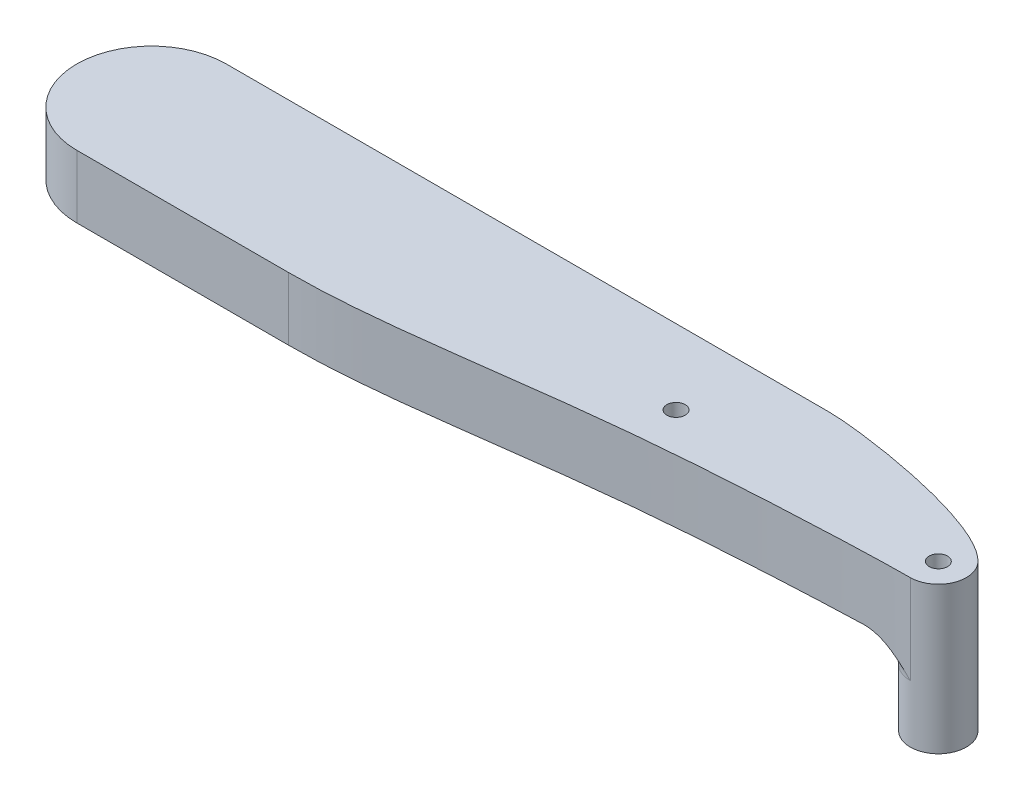
ISO-10303-21;
HEADER;
FILE_DESCRIPTION(('STEP AP214'),'2;1');
FILE_NAME('part.step','',(''),(''),'','','');
FILE_SCHEMA(('AUTOMOTIVE_DESIGN { 1 0 10303 214 1 1 1 1 }'));
ENDSEC;
DATA;
#1=APPLICATION_CONTEXT('core data for automotive mechanical design processes');
#2=APPLICATION_PROTOCOL_DEFINITION('international standard','automotive_design',2000,#1);
#3=PRODUCT_CONTEXT('',#1,'mechanical');
#4=PRODUCT('Part','Part','',(#3));
#5=PRODUCT_RELATED_PRODUCT_CATEGORY('part','',(#4));
#6=PRODUCT_DEFINITION_FORMATION('','',#4);
#7=PRODUCT_DEFINITION_CONTEXT('part definition',#1,'design');
#8=PRODUCT_DEFINITION('design','',#6,#7);
#9=PRODUCT_DEFINITION_SHAPE('','',#8);
#10=(LENGTH_UNIT() NAMED_UNIT(*) SI_UNIT(.MILLI.,.METRE.));
#11=(NAMED_UNIT(*) PLANE_ANGLE_UNIT() SI_UNIT($,.RADIAN.));
#12=(NAMED_UNIT(*) SI_UNIT($,.STERADIAN.) SOLID_ANGLE_UNIT());
#13=UNCERTAINTY_MEASURE_WITH_UNIT(LENGTH_MEASURE(1.E-05),#10,'distance_accuracy_value','');
#14=(GEOMETRIC_REPRESENTATION_CONTEXT(3) GLOBAL_UNCERTAINTY_ASSIGNED_CONTEXT((#13)) GLOBAL_UNIT_ASSIGNED_CONTEXT((#10,
#11,#12)) REPRESENTATION_CONTEXT('',''));
#15=CARTESIAN_POINT('',(0.,0.,0.));
#16=DIRECTION('',(0.,0.,1.));
#17=DIRECTION('',(1.,0.,0.));
#18=AXIS2_PLACEMENT_3D('',#15,#16,#17);
#19=CARTESIAN_POINT('',(-75.,12.,-14.25));
#20=DIRECTION('',(0.,0.,1.));
#21=DIRECTION('',(-1.,0.,0.));
#22=AXIS2_PLACEMENT_3D('',#19,#20,#21);
#23=PLANE('',#22);
#24=DIRECTION('',(0.,-1.,0.));
#25=VECTOR('',#24,1.);
#26=CARTESIAN_POINT('',(39.9337685956905,12.001,-14.25));
#27=LINE('',#26,#25);
#28=CARTESIAN_POINT('',(39.9337685956905,12.,-14.25));
#29=VERTEX_POINT('',#28);
#30=CARTESIAN_POINT('',(39.9337685956905,0.,-14.25));
#31=VERTEX_POINT('',#30);
#32=EDGE_CURVE('E124',#29,#31,#27,.T.);
#33=ORIENTED_EDGE('',*,*,#32,.T.);
#34=DIRECTION('',(1.,0.,0.));
#35=VECTOR('',#34,1.);
#36=CARTESIAN_POINT('',(-75.,0.,-14.25));
#37=LINE('',#36,#35);
#38=CARTESIAN_POINT('',(-75.,0.,-14.25));
#39=VERTEX_POINT('',#38);
#40=EDGE_CURVE('E142',#39,#31,#37,.T.);
#41=ORIENTED_EDGE('',*,*,#40,.F.);
#42=DIRECTION('',(0.,-1.,0.));
#43=VECTOR('',#42,1.);
#44=CARTESIAN_POINT('',(-75.,12.,-14.25));
#45=LINE('',#44,#43);
#46=CARTESIAN_POINT('',(-75.,12.,-14.25));
#47=VERTEX_POINT('',#46);
#48=EDGE_CURVE('E134',#47,#39,#45,.T.);
#49=ORIENTED_EDGE('',*,*,#48,.F.);
#50=DIRECTION('',(1.,0.,0.));
#51=VECTOR('',#50,1.);
#52=CARTESIAN_POINT('',(-75.,12.,-14.25));
#53=LINE('',#52,#51);
#54=EDGE_CURVE('E132',#47,#29,#53,.T.);
#55=ORIENTED_EDGE('',*,*,#54,.T.);
#56=EDGE_LOOP('',(#33,#41,#49,#55));
#57=FACE_BOUND('',#56,.T.);
#58=ADVANCED_FACE('F41',(#57),#23,.F.);
#59=CARTESIAN_POINT('',(-75.,12.,14.25));
#60=DIRECTION('',(0.,0.,1.));
#61=DIRECTION('',(-1.,0.,0.));
#62=AXIS2_PLACEMENT_3D('',#59,#60,#61);
#63=PLANE('',#62);
#64=DIRECTION('',(1.,0.,0.));
#65=VECTOR('',#64,1.);
#66=CARTESIAN_POINT('',(-75.,12.,14.25));
#67=LINE('',#66,#65);
#68=CARTESIAN_POINT('',(-75.,12.,14.25));
#69=VERTEX_POINT('',#68);
#70=CARTESIAN_POINT('',(-34.5980224377259,12.,14.25));
#71=VERTEX_POINT('',#70);
#72=EDGE_CURVE('E121',#69,#71,#67,.T.);
#73=ORIENTED_EDGE('',*,*,#72,.F.);
#74=DIRECTION('',(0.,-1.,0.));
#75=VECTOR('',#74,1.);
#76=CARTESIAN_POINT('',(-75.,12.,14.25));
#77=LINE('',#76,#75);
#78=CARTESIAN_POINT('',(-75.,0.,14.25));
#79=VERTEX_POINT('',#78);
#80=EDGE_CURVE('E131',#69,#79,#77,.T.);
#81=ORIENTED_EDGE('',*,*,#80,.T.);
#82=DIRECTION('',(1.,0.,0.));
#83=VECTOR('',#82,1.);
#84=CARTESIAN_POINT('',(-75.,0.,14.25));
#85=LINE('',#84,#83);
#86=CARTESIAN_POINT('',(-34.5980224377259,0.,14.25));
#87=VERTEX_POINT('',#86);
#88=EDGE_CURVE('E123',#79,#87,#85,.T.);
#89=ORIENTED_EDGE('',*,*,#88,.T.);
#90=DIRECTION('',(0.,-1.,0.));
#91=VECTOR('',#90,1.);
#92=CARTESIAN_POINT('',(-34.5980224377259,12.001,14.25));
#93=LINE('',#92,#91);
#94=EDGE_CURVE('E107',#71,#87,#93,.T.);
#95=ORIENTED_EDGE('',*,*,#94,.F.);
#96=EDGE_LOOP('',(#73,#81,#89,#95));
#97=FACE_BOUND('',#96,.T.);
#98=ADVANCED_FACE('F119',(#97),#63,.T.);
#99=CARTESIAN_POINT('',(-75.,0.,0.));
#100=DIRECTION('',(0.,1.,0.));
#101=DIRECTION('',(0.,0.,-1.));
#102=AXIS2_PLACEMENT_3D('',#99,#100,#101);
#103=PLANE('',#102);
#104=CARTESIAN_POINT('',(25.,0.,0.));
#105=DIRECTION('',(0.,-1.,0.));
#106=DIRECTION('',(0.,0.,-1.));
#107=AXIS2_PLACEMENT_3D('',#104,#105,#106);
#108=CIRCLE('',#107,1.75);
#109=CARTESIAN_POINT('',(25.,0.,-1.75));
#110=VERTEX_POINT('',#109);
#111=EDGE_CURVE('E143',#110,#110,#108,.T.);
#112=ORIENTED_EDGE('',*,*,#111,.F.);
#113=EDGE_LOOP('',(#112));
#114=FACE_BOUND('',#113,.T.);
#115=CARTESIAN_POINT('',(-34.5980224377259,0.,14.25));
#116=CARTESIAN_POINT('',(-16.7114247665398,0.,14.25));
#117=CARTESIAN_POINT('',(16.9697721095391,0.,7.11576395128839));
#118=CARTESIAN_POINT('',(68.5171140852767,0.,5.35000000000002));
#119=CARTESIAN_POINT('',(75.,0.,5.35000000000002));
#120=B_SPLINE_CURVE_WITH_KNOTS('',3,(#115,#116,#117,#118,#119),.UNSPECIFIED.,.F.,.F.,(4,1,4),
(0.,0.557363476483602,1.),.UNSPECIFIED.);
#121=CARTESIAN_POINT('',(66.2551672184016,0.,5.53628030557362));
#122=VERTEX_POINT('',#121);
#123=EDGE_CURVE('E179',#87,#122,#120,.T.);
#124=ORIENTED_EDGE('',*,*,#123,.F.);
#125=ORIENTED_EDGE('',*,*,#88,.F.);
#126=CARTESIAN_POINT('',(-75.,0.,0.));
#127=DIRECTION('',(0.,-1.,0.));
#128=DIRECTION('',(0.,0.,-1.));
#129=AXIS2_PLACEMENT_3D('',#126,#127,#128);
#130=CIRCLE('',#129,14.25);
#131=EDGE_CURVE('E140',#79,#39,#130,.T.);
#132=ORIENTED_EDGE('',*,*,#131,.T.);
#133=ORIENTED_EDGE('',*,*,#40,.T.);
#134=CARTESIAN_POINT('',(78.8479561308971,0.,-3.71695219429728));
#135=CARTESIAN_POINT('',(76.072393782244,0.,-6.5903392054546));
#136=CARTESIAN_POINT('',(61.3499696988219,0.,-12.0828531777784));
#137=CARTESIAN_POINT('',(43.7106323264205,0.,-14.25));
#138=CARTESIAN_POINT('',(39.9337685956905,0.,-14.25));
#139=B_SPLINE_CURVE_WITH_KNOTS('',3,(#134,#135,#136,#137,#138),.UNSPECIFIED.,.F.,.F.,(4,1,4),
(0.,0.424659955547958,1.),.UNSPECIFIED.);
#140=CARTESIAN_POINT('',(69.4691233137273,0.,-8.74825142992844));
#141=VERTEX_POINT('',#140);
#142=EDGE_CURVE('E172',#141,#31,#139,.T.);
#143=ORIENTED_EDGE('',*,*,#142,.F.);
#144=CARTESIAN_POINT('',(75.,0.,0.));
#145=DIRECTION('',(0.,-1.,0.));
#146=DIRECTION('',(0.,0.,-1.));
#147=AXIS2_PLACEMENT_3D('',#144,#145,#146);
#148=CIRCLE('',#147,10.35);
#149=EDGE_CURVE('E151',#122,#141,#148,.T.);
#150=ORIENTED_EDGE('',*,*,#149,.F.);
#151=EDGE_LOOP('',(#124,#125,#132,#133,#143,#150));
#152=FACE_BOUND('',#151,.T.);
#153=ADVANCED_FACE('F218',(#114,#152),#103,.F.);
#154=CARTESIAN_POINT('',(-75.,12.,0.));
#155=DIRECTION('',(0.,-1.,0.));
#156=DIRECTION('',(0.,0.,1.));
#157=AXIS2_PLACEMENT_3D('',#154,#155,#156);
#158=CYLINDRICAL_SURFACE('',#157,14.25);
#159=ORIENTED_EDGE('',*,*,#131,.F.);
#160=ORIENTED_EDGE('',*,*,#80,.F.);
#161=CARTESIAN_POINT('',(-75.,12.,0.));
#162=DIRECTION('',(0.,-1.,0.));
#163=DIRECTION('',(0.,0.,-1.));
#164=AXIS2_PLACEMENT_3D('',#161,#162,#163);
#165=CIRCLE('',#164,14.25);
#166=EDGE_CURVE('E129',#69,#47,#165,.T.);
#167=ORIENTED_EDGE('',*,*,#166,.T.);
#168=ORIENTED_EDGE('',*,*,#48,.T.);
#169=EDGE_LOOP('',(#159,#160,#167,#168));
#170=FACE_BOUND('',#169,.T.);
#171=ADVANCED_FACE('F210',(#170),#158,.T.);
#172=CARTESIAN_POINT('',(-75.,12.,0.));
#173=DIRECTION('',(0.,1.,0.));
#174=DIRECTION('',(0.,0.,-1.));
#175=AXIS2_PLACEMENT_3D('',#172,#173,#174);
#176=PLANE('',#175);
#177=ORIENTED_EDGE('',*,*,#54,.F.);
#178=ORIENTED_EDGE('',*,*,#166,.F.);
#179=ORIENTED_EDGE('',*,*,#72,.T.);
#180=CARTESIAN_POINT('',(-34.5980224377259,12.,14.25));
#181=CARTESIAN_POINT('',(-16.7114247665398,12.,14.25));
#182=CARTESIAN_POINT('',(16.9697721095391,12.,7.11576395128839));
#183=CARTESIAN_POINT('',(68.5171140852767,12.,5.35000000000002));
#184=CARTESIAN_POINT('',(75.,12.,5.35000000000002));
#185=B_SPLINE_CURVE_WITH_KNOTS('',3,(#180,#181,#182,#183,#184),.UNSPECIFIED.,.F.,.F.,(4,1,4),
(0.,0.557363476483602,1.),.UNSPECIFIED.);
#186=CARTESIAN_POINT('',(75.,12.,5.35000000000002));
#187=VERTEX_POINT('',#186);
#188=EDGE_CURVE('E103',#71,#187,#185,.T.);
#189=ORIENTED_EDGE('',*,*,#188,.T.);
#190=CARTESIAN_POINT('',(75.,12.,0.));
#191=DIRECTION('',(0.,-1.,0.));
#192=DIRECTION('',(0.,0.,-1.));
#193=AXIS2_PLACEMENT_3D('',#190,#191,#192);
#194=CIRCLE('',#193,5.35);
#195=CARTESIAN_POINT('',(78.8479561308971,12.,-3.71695219429727));
#196=VERTEX_POINT('',#195);
#197=EDGE_CURVE('E191',#196,#187,#194,.T.);
#198=ORIENTED_EDGE('',*,*,#197,.F.);
#199=CARTESIAN_POINT('',(78.8479561308971,12.,-3.71695219429728));
#200=CARTESIAN_POINT('',(76.072393782244,12.,-6.5903392054546));
#201=CARTESIAN_POINT('',(61.3499696988219,12.,-12.0828531777784));
#202=CARTESIAN_POINT('',(43.7106323264205,12.,-14.25));
#203=CARTESIAN_POINT('',(39.9337685956905,12.,-14.25));
#204=B_SPLINE_CURVE_WITH_KNOTS('',3,(#199,#200,#201,#202,#203),.UNSPECIFIED.,.F.,.F.,(4,1,4),
(0.,0.424659955547958,1.),.UNSPECIFIED.);
#205=EDGE_CURVE('E115',#196,#29,#204,.T.);
#206=ORIENTED_EDGE('',*,*,#205,.T.);
#207=EDGE_LOOP('',(#177,#178,#179,#189,#198,#206));
#208=FACE_BOUND('',#207,.T.);
#209=CARTESIAN_POINT('',(25.,12.,0.));
#210=DIRECTION('',(0.,-1.,0.));
#211=DIRECTION('',(0.,0.,-1.));
#212=AXIS2_PLACEMENT_3D('',#209,#210,#211);
#213=CIRCLE('',#212,1.75);
#214=CARTESIAN_POINT('',(25.,12.,-1.75));
#215=VERTEX_POINT('',#214);
#216=EDGE_CURVE('E205',#215,#215,#213,.T.);
#217=ORIENTED_EDGE('',*,*,#216,.T.);
#218=EDGE_LOOP('',(#217));
#219=FACE_BOUND('',#218,.T.);
#220=CARTESIAN_POINT('',(75.,12.,0.));
#221=DIRECTION('',(0.,-1.,0.));
#222=DIRECTION('',(0.,0.,-1.));
#223=AXIS2_PLACEMENT_3D('',#220,#221,#222);
#224=CIRCLE('',#223,1.75);
#225=CARTESIAN_POINT('',(75.,12.,-1.74999999999997));
#226=VERTEX_POINT('',#225);
#227=EDGE_CURVE('E202',#226,#226,#224,.T.);
#228=ORIENTED_EDGE('',*,*,#227,.T.);
#229=EDGE_LOOP('',(#228));
#230=FACE_BOUND('',#229,.T.);
#231=ADVANCED_FACE('F127',(#208,#219,#230),#176,.T.);
#232=CARTESIAN_POINT('',(75.,0.,0.));
#233=DIRECTION('',(0.,1.,0.));
#234=DIRECTION('',(0.,0.,-1.));
#235=AXIS2_PLACEMENT_3D('',#232,#233,#234);
#236=CYLINDRICAL_SURFACE('',#235,1.75);
#237=ORIENTED_EDGE('',*,*,#227,.F.);
#238=EDGE_LOOP('',(#237));
#239=FACE_BOUND('',#238,.T.);
#240=CARTESIAN_POINT('',(75.,-16.,0.));
#241=DIRECTION('',(0.,1.,0.));
#242=DIRECTION('',(0.,0.,1.));
#243=AXIS2_PLACEMENT_3D('',#240,#241,#242);
#244=CIRCLE('',#243,1.75);
#245=CARTESIAN_POINT('',(75.,-16.,1.75000000000002));
#246=VERTEX_POINT('',#245);
#247=EDGE_CURVE('E196',#246,#246,#244,.T.);
#248=ORIENTED_EDGE('',*,*,#247,.F.);
#249=EDGE_LOOP('',(#248));
#250=FACE_BOUND('',#249,.T.);
#251=ADVANCED_FACE('F250',(#239,#250),#236,.F.);
#252=CARTESIAN_POINT('',(25.,0.,0.));
#253=DIRECTION('',(0.,1.,0.));
#254=DIRECTION('',(0.,0.,-1.));
#255=AXIS2_PLACEMENT_3D('',#252,#253,#254);
#256=CYLINDRICAL_SURFACE('',#255,1.75);
#257=ORIENTED_EDGE('',*,*,#111,.T.);
#258=EDGE_LOOP('',(#257));
#259=FACE_BOUND('',#258,.T.);
#260=ORIENTED_EDGE('',*,*,#216,.F.);
#261=EDGE_LOOP('',(#260));
#262=FACE_BOUND('',#261,.T.);
#263=ADVANCED_FACE('F259',(#259,#262),#256,.F.);
#264=CARTESIAN_POINT('',(75.,-16.,0.));
#265=DIRECTION('',(0.,1.,0.));
#266=DIRECTION('',(0.,0.,-1.));
#267=AXIS2_PLACEMENT_3D('',#264,#265,#266);
#268=CYLINDRICAL_SURFACE('',#267,5.35);
#269=CARTESIAN_POINT('',(75.,-16.,0.));
#270=DIRECTION('',(0.,1.,0.));
#271=DIRECTION('',(0.,0.,1.));
#272=AXIS2_PLACEMENT_3D('',#269,#270,#271);
#273=CIRCLE('',#272,5.35);
#274=CARTESIAN_POINT('',(75.,-16.,5.35000000000002));
#275=VERTEX_POINT('',#274);
#276=EDGE_CURVE('E199',#275,#275,#273,.T.);
#277=ORIENTED_EDGE('',*,*,#276,.T.);
#278=EDGE_LOOP('',(#277));
#279=FACE_BOUND('',#278,.T.);
#280=CARTESIAN_POINT('',(75.,-5.,0.));
#281=DIRECTION('',(0.,-1.,0.));
#282=DIRECTION('',(0.,0.,-1.));
#283=AXIS2_PLACEMENT_3D('',#280,#281,#282);
#284=CIRCLE('',#283,5.35);
#285=CARTESIAN_POINT('',(78.8479561308971,-5.,-3.71695219429727));
#286=VERTEX_POINT('',#285);
#287=CARTESIAN_POINT('',(75.,-5.,5.35000000000002));
#288=VERTEX_POINT('',#287);
#289=EDGE_CURVE('E149',#286,#288,#284,.F.);
#290=ORIENTED_EDGE('',*,*,#289,.F.);
#291=DIRECTION('',(0.,-1.,0.));
#292=VECTOR('',#291,1.);
#293=CARTESIAN_POINT('',(78.8479561308971,12.001,-3.71695219429727));
#294=LINE('',#293,#292);
#295=EDGE_CURVE('E186',#196,#286,#294,.T.);
#296=ORIENTED_EDGE('',*,*,#295,.F.);
#297=ORIENTED_EDGE('',*,*,#197,.T.);
#298=DIRECTION('',(0.,-1.,0.));
#299=VECTOR('',#298,1.);
#300=CARTESIAN_POINT('',(75.,12.001,5.35000000000002));
#301=LINE('',#300,#299);
#302=EDGE_CURVE('E110',#187,#288,#301,.T.);
#303=ORIENTED_EDGE('',*,*,#302,.T.);
#304=EDGE_LOOP('',(#290,#296,#297,#303));
#305=FACE_BOUND('',#304,.T.);
#306=ADVANCED_FACE('F221',(#279,#305),#268,.T.);
#307=CARTESIAN_POINT('',(75.,-16.,0.));
#308=DIRECTION('',(0.,-1.,0.));
#309=DIRECTION('',(0.,0.,1.));
#310=AXIS2_PLACEMENT_3D('',#307,#308,#309);
#311=PLANE('',#310);
#312=ORIENTED_EDGE('',*,*,#247,.T.);
#313=EDGE_LOOP('',(#312));
#314=FACE_BOUND('',#313,.T.);
#315=ORIENTED_EDGE('',*,*,#276,.F.);
#316=EDGE_LOOP('',(#315));
#317=FACE_BOUND('',#316,.T.);
#318=ADVANCED_FACE('F233',(#314,#317),#311,.T.);
#319=CARTESIAN_POINT('',(78.8479561308971,12.001,-3.71695219429728));
#320=CARTESIAN_POINT('',(76.072393782244,12.001,-6.5903392054546));
#321=CARTESIAN_POINT('',(61.3499696988219,12.001,-12.0828531777784));
#322=CARTESIAN_POINT('',(43.7106323264205,12.001,-14.25));
#323=CARTESIAN_POINT('',(39.9337685956905,12.001,-14.25));
#324=B_SPLINE_CURVE_WITH_KNOTS('',3,(#319,#320,#321,#322,#323),.UNSPECIFIED.,.F.,.F.,(4,1,4),
(0.,0.424659955547958,1.),.UNSPECIFIED.);
#325=DIRECTION('',(0.,-1.,0.));
#326=VECTOR('',#325,1.);
#327=SURFACE_OF_LINEAR_EXTRUSION('',#324,#326);
#328=ORIENTED_EDGE('',*,*,#205,.F.);
#329=ORIENTED_EDGE('',*,*,#295,.T.);
#330=CARTESIAN_POINT('',(69.4691233137273,0.,-8.74825142992844));
#331=CARTESIAN_POINT('',(69.7162407882261,1.27748011082394E-05,-8.66245437018308));
#332=CARTESIAN_POINT('',(69.9626078338018,-0.0125491171100828,-8.57509437040546));
#333=CARTESIAN_POINT('',(70.4517020973873,-0.0605992398901504,-8.39780159957888));
#334=CARTESIAN_POINT('',(70.6944349001183,-0.0960475630018067,-8.30787356687471));
#335=CARTESIAN_POINT('',(71.1718444173519,-0.187062457598248,-8.12689029729118));
#336=CARTESIAN_POINT('',(71.4065850184374,-0.242359307322866,-8.03586527413685));
#337=CARTESIAN_POINT('',(71.8703242354991,-0.371039394805972,-7.85175522217886));
#338=CARTESIAN_POINT('',(72.0993197194223,-0.444432271604311,-7.75866911965032));
#339=CARTESIAN_POINT('',(72.674878457881,-0.651986117625774,-7.51888775781212));
#340=CARTESIAN_POINT('',(73.0168554919736,-0.797371556090492,-7.37085778621919));
#341=CARTESIAN_POINT('',(73.6837880315599,-1.11900178064745,-7.07018502336119));
#342=CARTESIAN_POINT('',(74.0087346410548,-1.29526249004828,-6.91753988568992));
#343=CARTESIAN_POINT('',(74.6434955543208,-1.67234957347362,-6.60592836092756));
#344=CARTESIAN_POINT('',(74.9532186930553,-1.87330343210543,-6.44693229645296));
#345=CARTESIAN_POINT('',(75.5568759828669,-2.29181499344903,-6.12150429630456));
#346=CARTESIAN_POINT('',(75.850813750054,-2.5093688655501,-5.955074079785));
#347=CARTESIAN_POINT('',(76.3796138184039,-2.91895253401387,-5.63853837748116));
#348=CARTESIAN_POINT('',(76.6164869748893,-3.10960306354139,-5.48999244960249));
#349=CARTESIAN_POINT('',(76.9649894689787,-3.39705063835836,-5.25933946851048));
#350=CARTESIAN_POINT('',(77.0799359553173,-3.49303682018004,-5.18121304727172));
#351=CARTESIAN_POINT('',(77.3077128325652,-3.68492409096192,-5.02182045700897));
#352=CARTESIAN_POINT('',(77.4205432164101,-3.78082517963702,-4.94055427750579));
#353=CARTESIAN_POINT('',(77.6332741862815,-3.96259175822075,-4.78237447157967));
#354=CARTESIAN_POINT('',(77.733367666282,-4.04852867841355,-4.70580286732104));
#355=CARTESIAN_POINT('',(77.9318084990127,-4.2191963594766,-4.54913752120451));
#356=CARTESIAN_POINT('',(78.0301559521028,-4.30392718961584,-4.46904398270991));
#357=CARTESIAN_POINT('',(78.2249537480479,-4.47149372823824,-4.30477466558188));
#358=CARTESIAN_POINT('',(78.3214048379872,-4.55433018520828,-4.22060054172594));
#359=CARTESIAN_POINT('',(78.5122076748607,-4.71734715722874,-4.04745761662758));
#360=CARTESIAN_POINT('',(78.6065598700402,-4.79752824119013,-3.95848985328919));
#361=CARTESIAN_POINT('',(78.7444834165372,-4.91361799665441,-3.82253296724145));
#362=CARTESIAN_POINT('',(78.7890128150304,-4.95092092452798,-3.77770258463803));
#363=CARTESIAN_POINT('',(78.8381365202115,-4.9918305416337,-3.72710495154958));
#364=CARTESIAN_POINT('',(78.8430483354543,-4.99591832817212,-3.722032961456));
#365=CARTESIAN_POINT('',(78.8479561308971,-5.,-3.71695219429726));
#366=B_SPLINE_CURVE_WITH_KNOTS('',3,(#330,#331,#332,#333,#334,#335,#336,#337,#338,#339,#340,
#341,#342,#343,#344,#345,#346,#347,#348,#349,#350,#351,#352,#353,#354,#355,#356,#357,#358,#359,
#360,#361,#362,#363,#364,#365),.UNSPECIFIED.,.F.,.F.,(4,2,2,2,2,2,2,2,2,2,2,2,2,2,2,2,2,4),(0.,
0.784171888015356,1.56698007158416,2.33953014215218,3.11249261204732,4.31045412731775,
5.50903529631697,6.71408720536138,7.91886187335509,8.93381135105744,9.44050116631598,
9.94719267283746,10.4047534731157,10.862287887553,11.3196382878055,11.776890058801,
11.9969988565836,12.0214743085639),.UNSPECIFIED.);
#367=EDGE_CURVE('E11',#141,#286,#366,.T.);
#368=ORIENTED_EDGE('',*,*,#367,.F.);
#369=ORIENTED_EDGE('',*,*,#142,.T.);
#370=ORIENTED_EDGE('',*,*,#32,.F.);
#371=EDGE_LOOP('',(#328,#329,#368,#369,#370));
#372=FACE_BOUND('',#371,.T.);
#373=ADVANCED_FACE('F160',(#372),#327,.F.);
#374=CARTESIAN_POINT('',(-34.5980224377259,12.001,14.25));
#375=CARTESIAN_POINT('',(-16.7114247665398,12.001,14.25));
#376=CARTESIAN_POINT('',(16.9697721095391,12.001,7.11576395128839));
#377=CARTESIAN_POINT('',(68.5171140852767,12.001,5.35000000000002));
#378=CARTESIAN_POINT('',(75.,12.001,5.35000000000002));
#379=B_SPLINE_CURVE_WITH_KNOTS('',3,(#374,#375,#376,#377,#378),.UNSPECIFIED.,.F.,.F.,(4,1,4),
(0.,0.557363476483602,1.),.UNSPECIFIED.);
#380=DIRECTION('',(0.,-1.,0.));
#381=VECTOR('',#380,1.);
#382=SURFACE_OF_LINEAR_EXTRUSION('',#379,#381);
#383=ORIENTED_EDGE('',*,*,#188,.F.);
#384=ORIENTED_EDGE('',*,*,#94,.T.);
#385=ORIENTED_EDGE('',*,*,#123,.T.);
#386=CARTESIAN_POINT('',(66.2551672184016,0.,5.53628030557362));
#387=CARTESIAN_POINT('',(66.469171831673,2.7526163092675E-05,5.52934133624696));
#388=CARTESIAN_POINT('',(66.6830549370466,-0.0102103952886642,5.52252599978187));
#389=CARTESIAN_POINT('',(67.1087483131879,-0.0497849331220507,5.50920403246953));
#390=CARTESIAN_POINT('',(67.3205612326467,-0.0790926014635715,5.5026969497263));
#391=CARTESIAN_POINT('',(67.7384270571091,-0.154926514796708,5.49010736517336));
#392=CARTESIAN_POINT('',(67.944518556504,-0.201242564127938,5.48402071511977));
#393=CARTESIAN_POINT('',(68.352578429492,-0.309675501481573,5.47221630833354));
#394=CARTESIAN_POINT('',(68.5545447666986,-0.371799998976676,5.46649873092214));
#395=CARTESIAN_POINT('',(69.0330971758725,-0.537997136532007,5.45325233210289));
#396=CARTESIAN_POINT('',(69.3073184984908,-0.648918143188869,5.44591058454164));
#397=CARTESIAN_POINT('',(69.8448032783703,-0.894670916389738,5.43201873464776));
#398=CARTESIAN_POINT('',(70.1080631275786,-1.02951048027828,5.42546889164696));
#399=CARTESIAN_POINT('',(70.6245680152153,-1.31988739492585,5.41313052751293));
#400=CARTESIAN_POINT('',(70.8777566397963,-1.47552449365025,5.40734596092998));
#401=CARTESIAN_POINT('',(71.3732791139093,-1.8033382062679,5.39656186574452));
#402=CARTESIAN_POINT('',(71.6156078060463,-1.9755225589412,5.39156270736782));
#403=CARTESIAN_POINT('',(72.1349079191348,-2.36653434578184,5.38147489203614));
#404=CARTESIAN_POINT('',(72.4098450834117,-2.58805068278525,5.37654553585045));
#405=CARTESIAN_POINT('',(72.9482826071423,-3.04443210284386,5.36779391501464));
#406=CARTESIAN_POINT('',(73.2117830018426,-3.27929714475501,5.36397164695241));
#407=CARTESIAN_POINT('',(73.7302346768364,-3.75760414501523,5.35753758705819));
#408=CARTESIAN_POINT('',(73.9851957682214,-4.00103555179908,5.3549243585361));
#409=CARTESIAN_POINT('',(74.4903377558122,-4.4927358075824,5.3511711122058));
#410=CARTESIAN_POINT('',(74.7405190309079,-4.7410042699772,5.35003097714602));
#411=CARTESIAN_POINT('',(74.9933159973708,-4.99332774686762,5.35000021487235));
#412=CARTESIAN_POINT('',(74.9966580619035,-4.99666381094927,5.35000000738095));
#413=CARTESIAN_POINT('',(75.,-5.,5.35000000000003));
#414=B_SPLINE_CURVE_WITH_KNOTS('',3,(#386,#387,#388,#389,#390,#391,#392,#393,#394,#395,#396,
#397,#398,#399,#400,#401,#402,#403,#404,#405,#406,#407,#408,#409,#410,#411,#412,#413),
.UNSPECIFIED.,.F.,.F.,(4,2,2,2,2,2,2,2,2,2,2,2,2,4),(0.,0.641922934771606,1.28287369122424,
1.91615619906444,2.54974411903925,3.43602215968588,4.32258965584178,5.21357303967188,
6.10497516330829,7.16367992520422,8.2223814240844,9.27982162637577,10.3371776560255,
10.3513441117543),.UNSPECIFIED.);
#415=EDGE_CURVE('E55',#288,#122,#414,.F.);
#416=ORIENTED_EDGE('',*,*,#415,.F.);
#417=ORIENTED_EDGE('',*,*,#302,.F.);
#418=EDGE_LOOP('',(#383,#384,#385,#416,#417));
#419=FACE_BOUND('',#418,.T.);
#420=ADVANCED_FACE('F105',(#419),#382,.F.);
#421=CARTESIAN_POINT('',(75.,-5.,0.));
#422=DIRECTION('',(0.,1.,0.));
#423=DIRECTION('',(0.,0.,-1.));
#424=AXIS2_PLACEMENT_3D('',#421,#422,#423);
#425=TOROIDAL_SURFACE('',#424,10.35,5.);
#426=ORIENTED_EDGE('',*,*,#367,.T.);
#427=ORIENTED_EDGE('',*,*,#289,.T.);
#428=ORIENTED_EDGE('',*,*,#415,.T.);
#429=ORIENTED_EDGE('',*,*,#149,.T.);
#430=EDGE_LOOP('',(#426,#427,#428,#429));
#431=FACE_BOUND('',#430,.T.);
#432=ADVANCED_FACE('F43',(#431),#425,.F.);
#433=CLOSED_SHELL('',(#58,#98,#153,#171,#231,#251,#263,#306,#318,#373,#420,#432));
#434=MANIFOLD_SOLID_BREP('B2',#433);
#435=ADVANCED_BREP_SHAPE_REPRESENTATION('',(#18,#434),#14);
#436=SHAPE_DEFINITION_REPRESENTATION(#9,#435);
ENDSEC;
END-ISO-10303-21;
